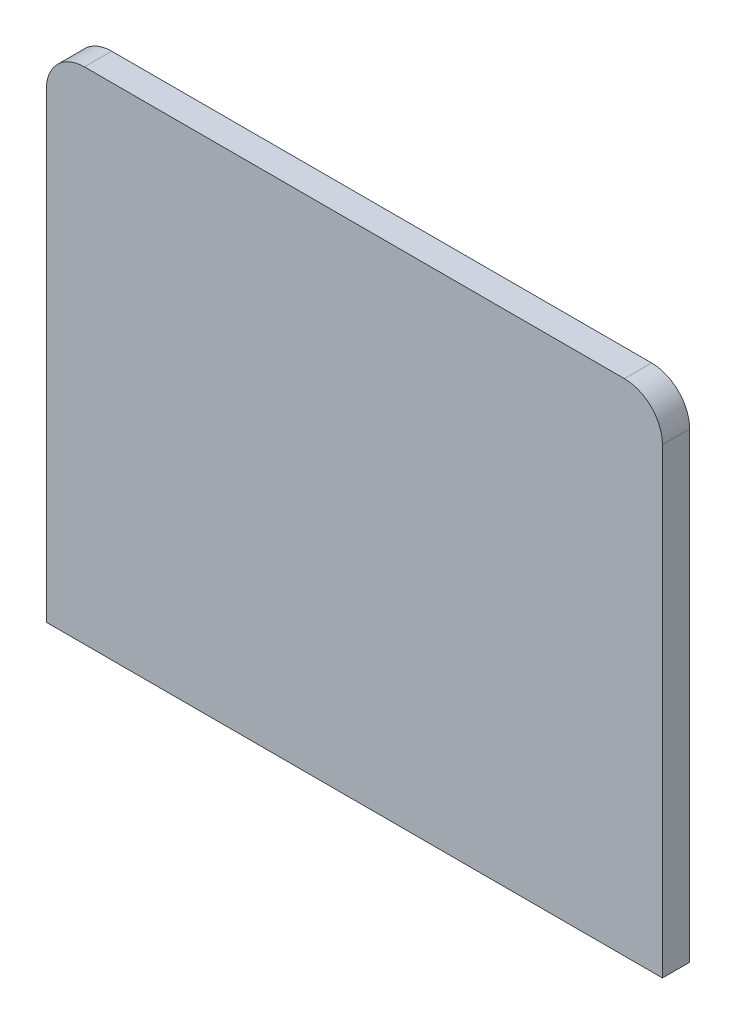
ISO-10303-21;
HEADER;
FILE_DESCRIPTION(('STEP AP214'),'2;1');
FILE_NAME('part.step','',(''),(''),'','','');
FILE_SCHEMA(('AUTOMOTIVE_DESIGN { 1 0 10303 214 1 1 1 1 }'));
ENDSEC;
DATA;
#1=APPLICATION_CONTEXT('core data for automotive mechanical design processes');
#2=APPLICATION_PROTOCOL_DEFINITION('international standard','automotive_design',2000,#1);
#3=PRODUCT_CONTEXT('',#1,'mechanical');
#4=PRODUCT('Part','Part','',(#3));
#5=PRODUCT_RELATED_PRODUCT_CATEGORY('part','',(#4));
#6=PRODUCT_DEFINITION_FORMATION('','',#4);
#7=PRODUCT_DEFINITION_CONTEXT('part definition',#1,'design');
#8=PRODUCT_DEFINITION('design','',#6,#7);
#9=PRODUCT_DEFINITION_SHAPE('','',#8);
#10=(LENGTH_UNIT() NAMED_UNIT(*) SI_UNIT(.MILLI.,.METRE.));
#11=(NAMED_UNIT(*) PLANE_ANGLE_UNIT() SI_UNIT($,.RADIAN.));
#12=(NAMED_UNIT(*) SI_UNIT($,.STERADIAN.) SOLID_ANGLE_UNIT());
#13=UNCERTAINTY_MEASURE_WITH_UNIT(LENGTH_MEASURE(1.E-05),#10,'distance_accuracy_value','');
#14=(GEOMETRIC_REPRESENTATION_CONTEXT(3) GLOBAL_UNCERTAINTY_ASSIGNED_CONTEXT((#13)) GLOBAL_UNIT_ASSIGNED_CONTEXT((#10,
#11,#12)) REPRESENTATION_CONTEXT('',''));
#15=CARTESIAN_POINT('',(0.,0.,0.));
#16=DIRECTION('',(0.,0.,1.));
#17=DIRECTION('',(1.,0.,0.));
#18=AXIS2_PLACEMENT_3D('',#15,#16,#17);
#19=CARTESIAN_POINT('',(-107.95,0.,-9.53));
#20=DIRECTION('',(-1.,0.,0.));
#21=DIRECTION('',(0.,0.,1.));
#22=AXIS2_PLACEMENT_3D('',#19,#20,#21);
#23=PLANE('',#22);
#24=DIRECTION('',(0.,-1.,0.));
#25=VECTOR('',#24,1.);
#26=CARTESIAN_POINT('',(-107.95,0.,0.));
#27=LINE('',#26,#25);
#28=CARTESIAN_POINT('',(-107.95,161.89,0.));
#29=VERTEX_POINT('',#28);
#30=CARTESIAN_POINT('',(-107.95,0.,0.));
#31=VERTEX_POINT('',#30);
#32=EDGE_CURVE('E126',#29,#31,#27,.T.);
#33=ORIENTED_EDGE('',*,*,#32,.F.);
#34=DIRECTION('',(0.,0.,1.));
#35=VECTOR('',#34,1.);
#36=CARTESIAN_POINT('',(-107.95,161.89,-9.53));
#37=LINE('',#36,#35);
#38=CARTESIAN_POINT('',(-107.95,161.89,-9.53));
#39=VERTEX_POINT('',#38);
#40=EDGE_CURVE('E11',#39,#29,#37,.T.);
#41=ORIENTED_EDGE('',*,*,#40,.F.);
#42=DIRECTION('',(0.,-1.,0.));
#43=VECTOR('',#42,1.);
#44=CARTESIAN_POINT('',(-107.95,0.,-9.53));
#45=LINE('',#44,#43);
#46=CARTESIAN_POINT('',(-107.95,0.,-9.53));
#47=VERTEX_POINT('',#46);
#48=EDGE_CURVE('E140',#39,#47,#45,.T.);
#49=ORIENTED_EDGE('',*,*,#48,.T.);
#50=DIRECTION('',(0.,0.,1.));
#51=VECTOR('',#50,1.);
#52=CARTESIAN_POINT('',(-107.95,0.,-9.53));
#53=LINE('',#52,#51);
#54=EDGE_CURVE('E44',#47,#31,#53,.T.);
#55=ORIENTED_EDGE('',*,*,#54,.T.);
#56=EDGE_LOOP('',(#33,#41,#49,#55));
#57=FACE_BOUND('',#56,.T.);
#58=ADVANCED_FACE('F41',(#57),#23,.T.);
#59=CARTESIAN_POINT('',(-94.6,161.89,-9.53));
#60=DIRECTION('',(0.,0.,1.));
#61=DIRECTION('',(1.,0.,0.));
#62=AXIS2_PLACEMENT_3D('',#59,#60,#61);
#63=CYLINDRICAL_SURFACE('',#62,13.35);
#64=CARTESIAN_POINT('',(-94.6,161.89,0.));
#65=DIRECTION('',(0.,0.,1.));
#66=DIRECTION('',(-1.,0.,0.));
#67=AXIS2_PLACEMENT_3D('',#64,#65,#66);
#68=CIRCLE('',#67,13.35);
#69=CARTESIAN_POINT('',(-94.5999999999999,175.24,0.));
#70=VERTEX_POINT('',#69);
#71=EDGE_CURVE('E138',#70,#29,#68,.T.);
#72=ORIENTED_EDGE('',*,*,#71,.F.);
#73=DIRECTION('',(0.,0.,1.));
#74=VECTOR('',#73,1.);
#75=CARTESIAN_POINT('',(-94.5999999999999,175.24,-9.53));
#76=LINE('',#75,#74);
#77=CARTESIAN_POINT('',(-94.5999999999999,175.24,-9.53));
#78=VERTEX_POINT('',#77);
#79=EDGE_CURVE('E50',#78,#70,#76,.T.);
#80=ORIENTED_EDGE('',*,*,#79,.F.);
#81=CARTESIAN_POINT('',(-94.6,161.89,-9.53));
#82=DIRECTION('',(0.,0.,1.));
#83=DIRECTION('',(-1.,0.,0.));
#84=AXIS2_PLACEMENT_3D('',#81,#82,#83);
#85=CIRCLE('',#84,13.35);
#86=EDGE_CURVE('E116',#78,#39,#85,.T.);
#87=ORIENTED_EDGE('',*,*,#86,.T.);
#88=ORIENTED_EDGE('',*,*,#40,.T.);
#89=EDGE_LOOP('',(#72,#80,#87,#88));
#90=FACE_BOUND('',#89,.T.);
#91=ADVANCED_FACE('F148',(#90),#63,.T.);
#92=CARTESIAN_POINT('',(-94.5999999999999,175.24,-9.53));
#93=DIRECTION('',(0.,1.,0.));
#94=DIRECTION('',(0.,0.,1.));
#95=AXIS2_PLACEMENT_3D('',#92,#93,#94);
#96=PLANE('',#95);
#97=DIRECTION('',(-1.,0.,0.));
#98=VECTOR('',#97,1.);
#99=CARTESIAN_POINT('',(-94.5999999999999,175.24,0.));
#100=LINE('',#99,#98);
#101=CARTESIAN_POINT('',(94.5999999999999,175.24,0.));
#102=VERTEX_POINT('',#101);
#103=EDGE_CURVE('E103',#102,#70,#100,.T.);
#104=ORIENTED_EDGE('',*,*,#103,.F.);
#105=DIRECTION('',(0.,0.,1.));
#106=VECTOR('',#105,1.);
#107=CARTESIAN_POINT('',(94.5999999999999,175.24,-9.53));
#108=LINE('',#107,#106);
#109=CARTESIAN_POINT('',(94.5999999999999,175.24,-9.53));
#110=VERTEX_POINT('',#109);
#111=EDGE_CURVE('E98',#110,#102,#108,.T.);
#112=ORIENTED_EDGE('',*,*,#111,.F.);
#113=DIRECTION('',(-1.,0.,0.));
#114=VECTOR('',#113,1.);
#115=CARTESIAN_POINT('',(-94.5999999999999,175.24,-9.53));
#116=LINE('',#115,#114);
#117=EDGE_CURVE('E101',#110,#78,#116,.T.);
#118=ORIENTED_EDGE('',*,*,#117,.T.);
#119=ORIENTED_EDGE('',*,*,#79,.T.);
#120=EDGE_LOOP('',(#104,#112,#118,#119));
#121=FACE_BOUND('',#120,.T.);
#122=ADVANCED_FACE('F100',(#121),#96,.T.);
#123=CARTESIAN_POINT('',(94.6,161.89,-9.53));
#124=DIRECTION('',(0.,0.,1.));
#125=DIRECTION('',(1.,0.,0.));
#126=AXIS2_PLACEMENT_3D('',#123,#124,#125);
#127=CYLINDRICAL_SURFACE('',#126,13.35);
#128=CARTESIAN_POINT('',(94.6,161.89,0.));
#129=DIRECTION('',(0.,0.,1.));
#130=DIRECTION('',(-1.,0.,0.));
#131=AXIS2_PLACEMENT_3D('',#128,#129,#130);
#132=CIRCLE('',#131,13.35);
#133=CARTESIAN_POINT('',(107.95,161.89,0.));
#134=VERTEX_POINT('',#133);
#135=EDGE_CURVE('E135',#134,#102,#132,.T.);
#136=ORIENTED_EDGE('',*,*,#135,.F.);
#137=DIRECTION('',(0.,0.,1.));
#138=VECTOR('',#137,1.);
#139=CARTESIAN_POINT('',(107.95,161.89,-9.53));
#140=LINE('',#139,#138);
#141=CARTESIAN_POINT('',(107.95,161.89,-9.53));
#142=VERTEX_POINT('',#141);
#143=EDGE_CURVE('E108',#142,#134,#140,.T.);
#144=ORIENTED_EDGE('',*,*,#143,.F.);
#145=CARTESIAN_POINT('',(94.6,161.89,-9.53));
#146=DIRECTION('',(0.,0.,1.));
#147=DIRECTION('',(-1.,0.,0.));
#148=AXIS2_PLACEMENT_3D('',#145,#146,#147);
#149=CIRCLE('',#148,13.35);
#150=EDGE_CURVE('E114',#142,#110,#149,.T.);
#151=ORIENTED_EDGE('',*,*,#150,.T.);
#152=ORIENTED_EDGE('',*,*,#111,.T.);
#153=EDGE_LOOP('',(#136,#144,#151,#152));
#154=FACE_BOUND('',#153,.T.);
#155=ADVANCED_FACE('F118',(#154),#127,.T.);
#156=CARTESIAN_POINT('',(107.95,0.,-9.53));
#157=DIRECTION('',(1.,0.,0.));
#158=DIRECTION('',(0.,0.,-1.));
#159=AXIS2_PLACEMENT_3D('',#156,#157,#158);
#160=PLANE('',#159);
#161=DIRECTION('',(0.,1.,0.));
#162=VECTOR('',#161,1.);
#163=CARTESIAN_POINT('',(107.95,0.,0.));
#164=LINE('',#163,#162);
#165=CARTESIAN_POINT('',(107.95,0.,0.));
#166=VERTEX_POINT('',#165);
#167=EDGE_CURVE('E132',#166,#134,#164,.T.);
#168=ORIENTED_EDGE('',*,*,#167,.F.);
#169=DIRECTION('',(0.,0.,1.));
#170=VECTOR('',#169,1.);
#171=CARTESIAN_POINT('',(107.95,0.,-9.53));
#172=LINE('',#171,#170);
#173=CARTESIAN_POINT('',(107.95,0.,-9.53));
#174=VERTEX_POINT('',#173);
#175=EDGE_CURVE('E143',#174,#166,#172,.T.);
#176=ORIENTED_EDGE('',*,*,#175,.F.);
#177=DIRECTION('',(0.,1.,0.));
#178=VECTOR('',#177,1.);
#179=CARTESIAN_POINT('',(107.95,0.,-9.53));
#180=LINE('',#179,#178);
#181=EDGE_CURVE('E119',#174,#142,#180,.T.);
#182=ORIENTED_EDGE('',*,*,#181,.T.);
#183=ORIENTED_EDGE('',*,*,#143,.T.);
#184=EDGE_LOOP('',(#168,#176,#182,#183));
#185=FACE_BOUND('',#184,.T.);
#186=ADVANCED_FACE('F161',(#185),#160,.T.);
#187=CARTESIAN_POINT('',(-107.95,0.,-9.53));
#188=DIRECTION('',(0.,-1.,0.));
#189=DIRECTION('',(0.,0.,-1.));
#190=AXIS2_PLACEMENT_3D('',#187,#188,#189);
#191=PLANE('',#190);
#192=DIRECTION('',(1.,0.,0.));
#193=VECTOR('',#192,1.);
#194=CARTESIAN_POINT('',(-107.95,0.,0.));
#195=LINE('',#194,#193);
#196=EDGE_CURVE('E129',#31,#166,#195,.T.);
#197=ORIENTED_EDGE('',*,*,#196,.F.);
#198=ORIENTED_EDGE('',*,*,#54,.F.);
#199=DIRECTION('',(1.,0.,0.));
#200=VECTOR('',#199,1.);
#201=CARTESIAN_POINT('',(-107.95,0.,-9.53));
#202=LINE('',#201,#200);
#203=EDGE_CURVE('E121',#47,#174,#202,.T.);
#204=ORIENTED_EDGE('',*,*,#203,.T.);
#205=ORIENTED_EDGE('',*,*,#175,.T.);
#206=EDGE_LOOP('',(#197,#198,#204,#205));
#207=FACE_BOUND('',#206,.T.);
#208=ADVANCED_FACE('F145',(#207),#191,.T.);
#209=CARTESIAN_POINT('',(-94.6,161.89,-9.53));
#210=DIRECTION('',(0.,0.,-1.));
#211=DIRECTION('',(-1.,0.,0.));
#212=AXIS2_PLACEMENT_3D('',#209,#210,#211);
#213=PLANE('',#212);
#214=ORIENTED_EDGE('',*,*,#48,.F.);
#215=ORIENTED_EDGE('',*,*,#86,.F.);
#216=ORIENTED_EDGE('',*,*,#117,.F.);
#217=ORIENTED_EDGE('',*,*,#150,.F.);
#218=ORIENTED_EDGE('',*,*,#181,.F.);
#219=ORIENTED_EDGE('',*,*,#203,.F.);
#220=EDGE_LOOP('',(#214,#215,#216,#217,#218,#219));
#221=FACE_BOUND('',#220,.T.);
#222=ADVANCED_FACE('F112',(#221),#213,.T.);
#223=CARTESIAN_POINT('',(-94.6,161.89,0.));
#224=DIRECTION('',(0.,0.,-1.));
#225=DIRECTION('',(-1.,0.,0.));
#226=AXIS2_PLACEMENT_3D('',#223,#224,#225);
#227=PLANE('',#226);
#228=ORIENTED_EDGE('',*,*,#32,.T.);
#229=ORIENTED_EDGE('',*,*,#196,.T.);
#230=ORIENTED_EDGE('',*,*,#167,.T.);
#231=ORIENTED_EDGE('',*,*,#135,.T.);
#232=ORIENTED_EDGE('',*,*,#103,.T.);
#233=ORIENTED_EDGE('',*,*,#71,.T.);
#234=EDGE_LOOP('',(#228,#229,#230,#231,#232,#233));
#235=FACE_BOUND('',#234,.T.);
#236=ADVANCED_FACE('F147',(#235),#227,.F.);
#237=CLOSED_SHELL('',(#58,#91,#122,#155,#186,#208,#222,#236));
#238=MANIFOLD_SOLID_BREP('B2',#237);
#239=ADVANCED_BREP_SHAPE_REPRESENTATION('',(#18,#238),#14);
#240=SHAPE_DEFINITION_REPRESENTATION(#9,#239);
ENDSEC;
END-ISO-10303-21;
